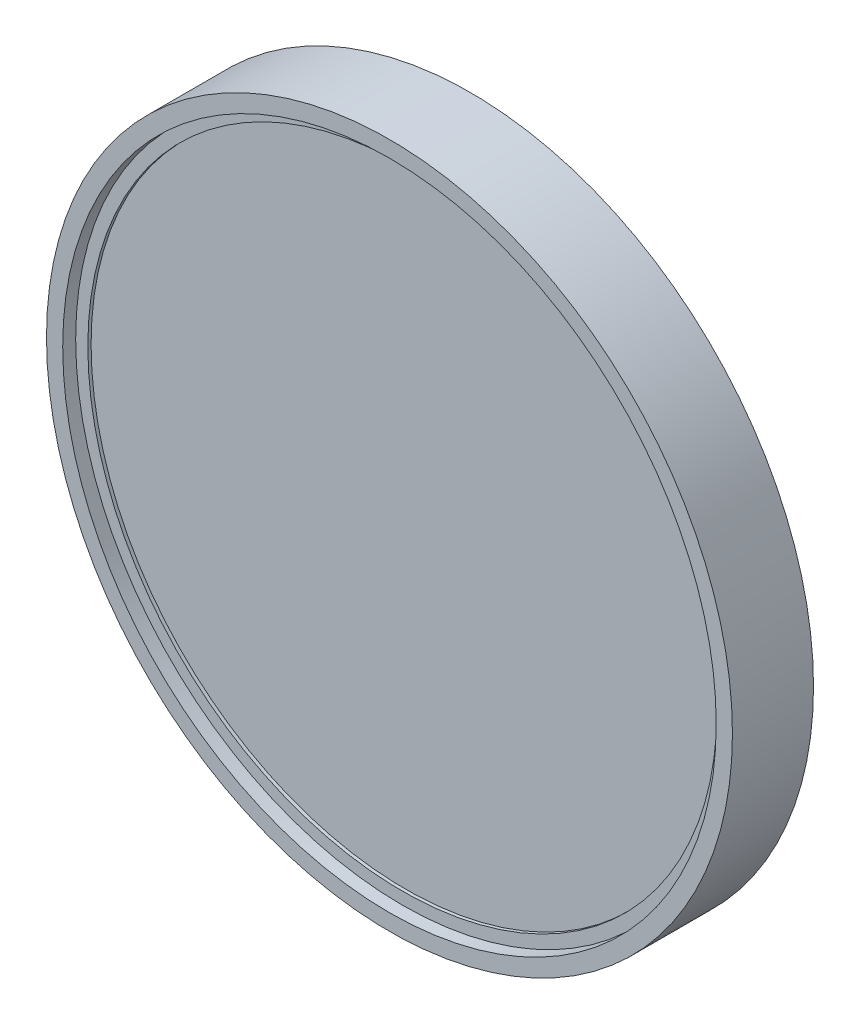
ISO-10303-21;
HEADER;
FILE_DESCRIPTION(('STEP AP214'),'2;1');
FILE_NAME('part.step','',(''),(''),'','','');
FILE_SCHEMA(('AUTOMOTIVE_DESIGN { 1 0 10303 214 1 1 1 1 }'));
ENDSEC;
DATA;
#1=APPLICATION_CONTEXT('core data for automotive mechanical design processes');
#2=APPLICATION_PROTOCOL_DEFINITION('international standard','automotive_design',2000,#1);
#3=PRODUCT_CONTEXT('',#1,'mechanical');
#4=PRODUCT('Part','Part','',(#3));
#5=PRODUCT_RELATED_PRODUCT_CATEGORY('part','',(#4));
#6=PRODUCT_DEFINITION_FORMATION('','',#4);
#7=PRODUCT_DEFINITION_CONTEXT('part definition',#1,'design');
#8=PRODUCT_DEFINITION('design','',#6,#7);
#9=PRODUCT_DEFINITION_SHAPE('','',#8);
#10=(LENGTH_UNIT() NAMED_UNIT(*) SI_UNIT(.MILLI.,.METRE.));
#11=(NAMED_UNIT(*) PLANE_ANGLE_UNIT() SI_UNIT($,.RADIAN.));
#12=(NAMED_UNIT(*) SI_UNIT($,.STERADIAN.) SOLID_ANGLE_UNIT());
#13=UNCERTAINTY_MEASURE_WITH_UNIT(LENGTH_MEASURE(1.E-05),#10,'distance_accuracy_value','');
#14=(GEOMETRIC_REPRESENTATION_CONTEXT(3) GLOBAL_UNCERTAINTY_ASSIGNED_CONTEXT((#13)) GLOBAL_UNIT_ASSIGNED_CONTEXT((#10,
#11,#12)) REPRESENTATION_CONTEXT('',''));
#15=CARTESIAN_POINT('',(0.,0.,0.));
#16=DIRECTION('',(0.,0.,1.));
#17=DIRECTION('',(1.,0.,0.));
#18=AXIS2_PLACEMENT_3D('',#15,#16,#17);
#19=CARTESIAN_POINT('',(0.,0.,-6.35));
#20=DIRECTION('',(0.,0.,1.));
#21=DIRECTION('',(1.,0.,0.));
#22=AXIS2_PLACEMENT_3D('',#19,#20,#21);
#23=CYLINDRICAL_SURFACE('',#22,26.8605);
#24=CARTESIAN_POINT('',(0.,0.,-6.35));
#25=DIRECTION('',(0.,0.,1.));
#26=DIRECTION('',(1.,0.,0.));
#27=AXIS2_PLACEMENT_3D('',#24,#25,#26);
#28=CIRCLE('',#27,26.8605);
#29=CARTESIAN_POINT('',(26.8605,0.,-6.35));
#30=VERTEX_POINT('',#29);
#31=EDGE_CURVE('E10',#30,#30,#28,.T.);
#32=ORIENTED_EDGE('',*,*,#31,.T.);
#33=EDGE_LOOP('',(#32));
#34=FACE_BOUND('',#33,.T.);
#35=CARTESIAN_POINT('',(0.,0.,0.));
#36=DIRECTION('',(0.,0.,1.));
#37=DIRECTION('',(1.,0.,0.));
#38=AXIS2_PLACEMENT_3D('',#35,#36,#37);
#39=CIRCLE('',#38,26.8605);
#40=CARTESIAN_POINT('',(26.8605,0.,0.));
#41=VERTEX_POINT('',#40);
#42=EDGE_CURVE('E42',#41,#41,#39,.T.);
#43=ORIENTED_EDGE('',*,*,#42,.F.);
#44=EDGE_LOOP('',(#43));
#45=FACE_BOUND('',#44,.T.);
#46=ADVANCED_FACE('F35',(#34,#45),#23,.T.);
#47=CARTESIAN_POINT('',(0.,0.,-6.35));
#48=DIRECTION('',(0.,0.,1.));
#49=DIRECTION('',(1.,0.,0.));
#50=AXIS2_PLACEMENT_3D('',#47,#48,#49);
#51=PLANE('',#50);
#52=CARTESIAN_POINT('',(0.,0.,-6.35));
#53=DIRECTION('',(0.,0.,-1.));
#54=DIRECTION('',(-1.,0.,0.));
#55=AXIS2_PLACEMENT_3D('',#52,#53,#54);
#56=CIRCLE('',#55,4.8895);
#57=CARTESIAN_POINT('',(-4.8895,0.,-6.35));
#58=VERTEX_POINT('',#57);
#59=EDGE_CURVE('E58',#58,#58,#56,.T.);
#60=ORIENTED_EDGE('',*,*,#59,.F.);
#61=EDGE_LOOP('',(#60));
#62=FACE_BOUND('',#61,.T.);
#63=ORIENTED_EDGE('',*,*,#31,.F.);
#64=EDGE_LOOP('',(#63));
#65=FACE_BOUND('',#64,.T.);
#66=ADVANCED_FACE('F73',(#62,#65),#51,.F.);
#67=CARTESIAN_POINT('',(0.,0.,0.));
#68=DIRECTION('',(0.,0.,1.));
#69=DIRECTION('',(1.,0.,0.));
#70=AXIS2_PLACEMENT_3D('',#67,#68,#69);
#71=PLANE('',#70);
#72=CARTESIAN_POINT('',(0.,0.,0.));
#73=DIRECTION('',(0.,0.,1.));
#74=DIRECTION('',(1.,0.,0.));
#75=AXIS2_PLACEMENT_3D('',#72,#73,#74);
#76=CIRCLE('',#75,25.5905);
#77=CARTESIAN_POINT('',(25.5905,0.,0.));
#78=VERTEX_POINT('',#77);
#79=EDGE_CURVE('E51',#78,#78,#76,.T.);
#80=ORIENTED_EDGE('',*,*,#79,.F.);
#81=EDGE_LOOP('',(#80));
#82=FACE_BOUND('',#81,.T.);
#83=ORIENTED_EDGE('',*,*,#42,.T.);
#84=EDGE_LOOP('',(#83));
#85=FACE_BOUND('',#84,.T.);
#86=ADVANCED_FACE('F76',(#82,#85),#71,.T.);
#87=CARTESIAN_POINT('',(0.,0.,-1.016));
#88=DIRECTION('',(0.,0.,1.));
#89=DIRECTION('',(1.,0.,0.));
#90=AXIS2_PLACEMENT_3D('',#87,#88,#89);
#91=PLANE('',#90);
#92=CARTESIAN_POINT('',(0.,0.,-1.016));
#93=DIRECTION('',(0.,0.,1.));
#94=DIRECTION('',(1.,0.,0.));
#95=AXIS2_PLACEMENT_3D('',#92,#93,#94);
#96=CIRCLE('',#95,25.5905);
#97=CARTESIAN_POINT('',(25.5905,0.,-1.016));
#98=VERTEX_POINT('',#97);
#99=EDGE_CURVE('E54',#98,#98,#96,.T.);
#100=ORIENTED_EDGE('',*,*,#99,.T.);
#101=EDGE_LOOP('',(#100));
#102=FACE_BOUND('',#101,.T.);
#103=CARTESIAN_POINT('',(0.,0.,-1.016));
#104=DIRECTION('',(0.,0.,1.));
#105=DIRECTION('',(1.,0.,0.));
#106=AXIS2_PLACEMENT_3D('',#103,#104,#105);
#107=CIRCLE('',#106,24.638);
#108=CARTESIAN_POINT('',(24.638,0.,-1.016));
#109=VERTEX_POINT('',#108);
#110=EDGE_CURVE('E38',#109,#109,#107,.F.);
#111=ORIENTED_EDGE('',*,*,#110,.T.);
#112=EDGE_LOOP('',(#111));
#113=FACE_BOUND('',#112,.T.);
#114=ADVANCED_FACE('F82',(#102,#113),#91,.T.);
#115=CARTESIAN_POINT('',(0.,0.,-1.016));
#116=DIRECTION('',(0.,0.,1.));
#117=DIRECTION('',(1.,0.,0.));
#118=AXIS2_PLACEMENT_3D('',#115,#116,#117);
#119=CYLINDRICAL_SURFACE('',#118,25.5905);
#120=ORIENTED_EDGE('',*,*,#99,.F.);
#121=EDGE_LOOP('',(#120));
#122=FACE_BOUND('',#121,.T.);
#123=ORIENTED_EDGE('',*,*,#79,.T.);
#124=EDGE_LOOP('',(#123));
#125=FACE_BOUND('',#124,.T.);
#126=ADVANCED_FACE('F91',(#122,#125),#119,.F.);
#127=CARTESIAN_POINT('',(0.,0.,-1.27));
#128=DIRECTION('',(0.,0.,1.));
#129=DIRECTION('',(1.,0.,0.));
#130=AXIS2_PLACEMENT_3D('',#127,#128,#129);
#131=PLANE('',#130);
#132=CARTESIAN_POINT('',(0.,0.,-1.27));
#133=DIRECTION('',(0.,0.,1.));
#134=DIRECTION('',(1.,0.,0.));
#135=AXIS2_PLACEMENT_3D('',#132,#133,#134);
#136=CIRCLE('',#135,24.638);
#137=CARTESIAN_POINT('',(24.638,0.,-1.27));
#138=VERTEX_POINT('',#137);
#139=EDGE_CURVE('E47',#138,#138,#136,.T.);
#140=ORIENTED_EDGE('',*,*,#139,.T.);
#141=EDGE_LOOP('',(#140));
#142=FACE_BOUND('',#141,.T.);
#143=ADVANCED_FACE('F87',(#142),#131,.T.);
#144=CARTESIAN_POINT('',(0.,0.,-1.27));
#145=DIRECTION('',(0.,0.,1.));
#146=DIRECTION('',(1.,0.,0.));
#147=AXIS2_PLACEMENT_3D('',#144,#145,#146);
#148=CYLINDRICAL_SURFACE('',#147,24.638);
#149=ORIENTED_EDGE('',*,*,#139,.F.);
#150=EDGE_LOOP('',(#149));
#151=FACE_BOUND('',#150,.T.);
#152=ORIENTED_EDGE('',*,*,#110,.F.);
#153=EDGE_LOOP('',(#152));
#154=FACE_BOUND('',#153,.T.);
#155=ADVANCED_FACE('F69',(#151,#154),#148,.F.);
#156=CARTESIAN_POINT('',(0.,0.,-3.175));
#157=DIRECTION('',(0.,0.,-1.));
#158=DIRECTION('',(-1.,0.,0.));
#159=AXIS2_PLACEMENT_3D('',#156,#157,#158);
#160=CYLINDRICAL_SURFACE('',#159,4.8895);
#161=CARTESIAN_POINT('',(0.,0.,-3.175));
#162=DIRECTION('',(0.,0.,-1.));
#163=DIRECTION('',(-1.,0.,0.));
#164=AXIS2_PLACEMENT_3D('',#161,#162,#163);
#165=CIRCLE('',#164,4.8895);
#166=CARTESIAN_POINT('',(-4.8895,0.,-3.175));
#167=VERTEX_POINT('',#166);
#168=EDGE_CURVE('E55',#167,#167,#165,.T.);
#169=ORIENTED_EDGE('',*,*,#168,.F.);
#170=EDGE_LOOP('',(#169));
#171=FACE_BOUND('',#170,.T.);
#172=ORIENTED_EDGE('',*,*,#59,.T.);
#173=EDGE_LOOP('',(#172));
#174=FACE_BOUND('',#173,.T.);
#175=ADVANCED_FACE('F66',(#171,#174),#160,.F.);
#176=CARTESIAN_POINT('',(0.,0.,-3.175));
#177=DIRECTION('',(0.,0.,-1.));
#178=DIRECTION('',(-1.,0.,0.));
#179=AXIS2_PLACEMENT_3D('',#176,#177,#178);
#180=PLANE('',#179);
#181=ORIENTED_EDGE('',*,*,#168,.T.);
#182=EDGE_LOOP('',(#181));
#183=FACE_BOUND('',#182,.T.);
#184=ADVANCED_FACE('F64',(#183),#180,.T.);
#185=CLOSED_SHELL('',(#46,#66,#86,#114,#126,#143,#155,#175,#184));
#186=MANIFOLD_SOLID_BREP('B2',#185);
#187=ADVANCED_BREP_SHAPE_REPRESENTATION('',(#18,#186),#14);
#188=SHAPE_DEFINITION_REPRESENTATION(#9,#187);
ENDSEC;
END-ISO-10303-21;
